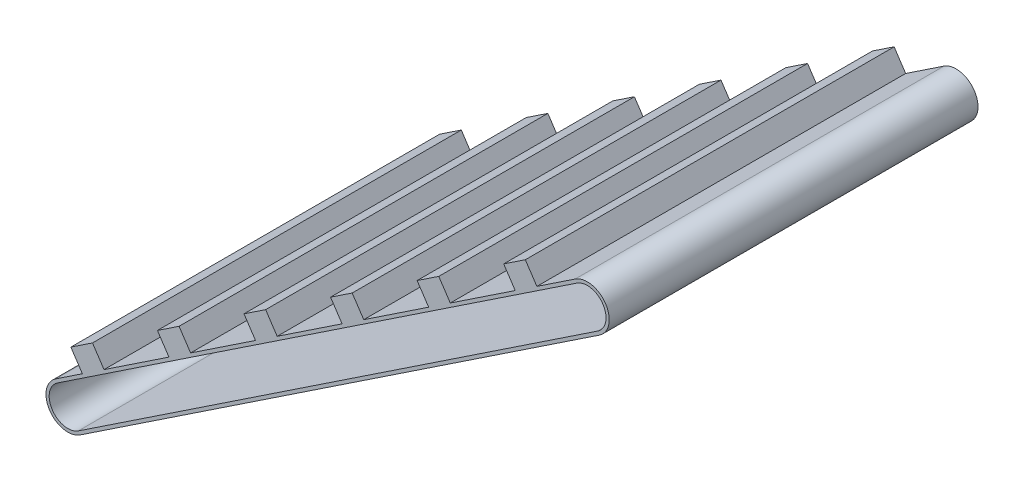
ISO-10303-21;
HEADER;
FILE_DESCRIPTION(('STEP AP214'),'2;1');
FILE_NAME('part.step','',(''),(''),'','','');
FILE_SCHEMA(('AUTOMOTIVE_DESIGN { 1 0 10303 214 1 1 1 1 }'));
ENDSEC;
DATA;
#1=APPLICATION_CONTEXT('core data for automotive mechanical design processes');
#2=APPLICATION_PROTOCOL_DEFINITION('international standard','automotive_design',2000,#1);
#3=PRODUCT_CONTEXT('',#1,'mechanical');
#4=PRODUCT('Part','Part','',(#3));
#5=PRODUCT_RELATED_PRODUCT_CATEGORY('part','',(#4));
#6=PRODUCT_DEFINITION_FORMATION('','',#4);
#7=PRODUCT_DEFINITION_CONTEXT('part definition',#1,'design');
#8=PRODUCT_DEFINITION('design','',#6,#7);
#9=PRODUCT_DEFINITION_SHAPE('','',#8);
#10=(LENGTH_UNIT() NAMED_UNIT(*) SI_UNIT(.MILLI.,.METRE.));
#11=(NAMED_UNIT(*) PLANE_ANGLE_UNIT() SI_UNIT($,.RADIAN.));
#12=(NAMED_UNIT(*) SI_UNIT($,.STERADIAN.) SOLID_ANGLE_UNIT());
#13=UNCERTAINTY_MEASURE_WITH_UNIT(LENGTH_MEASURE(1.E-05),#10,'distance_accuracy_value','');
#14=(GEOMETRIC_REPRESENTATION_CONTEXT(3) GLOBAL_UNCERTAINTY_ASSIGNED_CONTEXT((#13)) GLOBAL_UNIT_ASSIGNED_CONTEXT((#10,
#11,#12)) REPRESENTATION_CONTEXT('',''));
#15=CARTESIAN_POINT('',(0.,0.,0.));
#16=DIRECTION('',(0.,0.,1.));
#17=DIRECTION('',(1.,0.,0.));
#18=AXIS2_PLACEMENT_3D('',#15,#16,#17);
#19=CARTESIAN_POINT('',(-2.33496558165911,3.50348965825732,70.9));
#20=DIRECTION('',(0.554586043536986,-0.832126384820234,0.));
#21=DIRECTION('',(0.832126384820234,0.554586043536986,0.));
#22=AXIS2_PLACEMENT_3D('',#19,#20,#21);
#23=PLANE('',#22);
#24=DIRECTION('',(0.,0.,1.));
#25=VECTOR('',#24,1.);
#26=CARTESIAN_POINT('',(85.998107620927,62.3747025828039,0.));
#27=LINE('',#26,#25);
#28=CARTESIAN_POINT('',(85.998107620927,62.3747025828039,0.));
#29=VERTEX_POINT('',#28);
#30=CARTESIAN_POINT('',(85.998107620927,62.3747025828039,70.9));
#31=VERTEX_POINT('',#30);
#32=EDGE_CURVE('E278',#29,#31,#27,.T.);
#33=ORIENTED_EDGE('',*,*,#32,.F.);
#34=DIRECTION('',(-0.832126384820234,-0.554586043536986,0.));
#35=VECTOR('',#34,1.);
#36=CARTESIAN_POINT('',(-2.33496558165911,3.50348965825732,0.));
#37=LINE('',#36,#35);
#38=CARTESIAN_POINT('',(73.5162118486235,54.0559119297492,0.));
#39=VERTEX_POINT('',#38);
#40=EDGE_CURVE('E542',#29,#39,#37,.T.);
#41=ORIENTED_EDGE('',*,*,#40,.T.);
#42=DIRECTION('',(0.,0.,-1.));
#43=VECTOR('',#42,1.);
#44=CARTESIAN_POINT('',(73.5162118486235,54.0559119297491,0.));
#45=LINE('',#44,#43);
#46=CARTESIAN_POINT('',(73.5162118486235,54.0559119297492,70.9));
#47=VERTEX_POINT('',#46);
#48=EDGE_CURVE('E285',#47,#39,#45,.T.);
#49=ORIENTED_EDGE('',*,*,#48,.F.);
#50=DIRECTION('',(-0.832126384820234,-0.554586043536986,0.));
#51=VECTOR('',#50,1.);
#52=CARTESIAN_POINT('',(-2.33496558165911,3.50348965825732,70.9));
#53=LINE('',#52,#51);
#54=EDGE_CURVE('E57',#31,#47,#53,.T.);
#55=ORIENTED_EDGE('',*,*,#54,.F.);
#56=EDGE_LOOP('',(#33,#41,#49,#55));
#57=FACE_BOUND('',#56,.T.);
#58=ADVANCED_FACE('F41',(#57),#23,.F.);
#59=DIRECTION('',(0.,0.,-1.));
#60=VECTOR('',#59,1.);
#61=CARTESIAN_POINT('',(90.1587395450282,65.1476328004889,0.));
#62=LINE('',#61,#60);
#63=CARTESIAN_POINT('',(90.1587395450282,65.1476328004889,70.9));
#64=VERTEX_POINT('',#63);
#65=CARTESIAN_POINT('',(90.1587395450282,65.1476328004889,0.));
#66=VERTEX_POINT('',#65);
#67=EDGE_CURVE('E65',#64,#66,#62,.T.);
#68=ORIENTED_EDGE('',*,*,#67,.F.);
#69=CARTESIAN_POINT('',(97.520200596769,70.0538148826957,70.9));
#70=VERTEX_POINT('',#69);
#71=EDGE_CURVE('E526',#70,#64,#53,.T.);
#72=ORIENTED_EDGE('',*,*,#71,.F.);
#73=DIRECTION('',(0.,0.,-1.));
#74=VECTOR('',#73,1.);
#75=CARTESIAN_POINT('',(97.520200596769,70.0538148826957,70.9));
#76=LINE('',#75,#74);
#77=CARTESIAN_POINT('',(97.520200596769,70.0538148826957,0.));
#78=VERTEX_POINT('',#77);
#79=EDGE_CURVE('E546',#70,#78,#76,.T.);
#80=ORIENTED_EDGE('',*,*,#79,.T.);
#81=EDGE_CURVE('E519',#78,#66,#37,.T.);
#82=ORIENTED_EDGE('',*,*,#81,.T.);
#83=EDGE_LOOP('',(#68,#72,#80,#82));
#84=FACE_BOUND('',#83,.T.);
#85=ADVANCED_FACE('F565',(#84),#23,.F.);
#86=DIRECTION('',(0.,0.,1.));
#87=VECTOR('',#86,1.);
#88=CARTESIAN_POINT('',(69.3555799245223,51.2829817120642,0.));
#89=LINE('',#88,#87);
#90=CARTESIAN_POINT('',(69.3555799245223,51.2829817120642,0.));
#91=VERTEX_POINT('',#90);
#92=CARTESIAN_POINT('',(69.3555799245223,51.2829817120642,70.9));
#93=VERTEX_POINT('',#92);
#94=EDGE_CURVE('E280',#91,#93,#89,.T.);
#95=ORIENTED_EDGE('',*,*,#94,.F.);
#96=CARTESIAN_POINT('',(56.8736841522188,42.9641910590094,0.));
#97=VERTEX_POINT('',#96);
#98=EDGE_CURVE('E583',#91,#97,#37,.T.);
#99=ORIENTED_EDGE('',*,*,#98,.T.);
#100=DIRECTION('',(0.,0.,-1.));
#101=VECTOR('',#100,1.);
#102=CARTESIAN_POINT('',(56.8736841522188,42.9641910590094,0.));
#103=LINE('',#102,#101);
#104=CARTESIAN_POINT('',(56.8736841522188,42.9641910590094,70.9));
#105=VERTEX_POINT('',#104);
#106=EDGE_CURVE('E329',#105,#97,#103,.T.);
#107=ORIENTED_EDGE('',*,*,#106,.F.);
#108=EDGE_CURVE('E642',#93,#105,#53,.T.);
#109=ORIENTED_EDGE('',*,*,#108,.F.);
#110=EDGE_LOOP('',(#95,#99,#107,#109));
#111=FACE_BOUND('',#110,.T.);
#112=ADVANCED_FACE('F590',(#111),#23,.F.);
#113=DIRECTION('',(0.,0.,1.));
#114=VECTOR('',#113,1.);
#115=CARTESIAN_POINT('',(52.7130522281177,40.1912608413245,0.));
#116=LINE('',#115,#114);
#117=CARTESIAN_POINT('',(52.7130522281177,40.1912608413245,0.));
#118=VERTEX_POINT('',#117);
#119=CARTESIAN_POINT('',(52.7130522281176,40.1912608413245,70.9));
#120=VERTEX_POINT('',#119);
#121=EDGE_CURVE('E323',#118,#120,#116,.T.);
#122=ORIENTED_EDGE('',*,*,#121,.F.);
#123=CARTESIAN_POINT('',(40.2311564558142,31.8724701882697,0.));
#124=VERTEX_POINT('',#123);
#125=EDGE_CURVE('E618',#118,#124,#37,.T.);
#126=ORIENTED_EDGE('',*,*,#125,.T.);
#127=DIRECTION('',(0.,0.,-1.));
#128=VECTOR('',#127,1.);
#129=CARTESIAN_POINT('',(40.2311564558141,31.8724701882697,0.));
#130=LINE('',#129,#128);
#131=CARTESIAN_POINT('',(40.2311564558142,31.8724701882697,70.9));
#132=VERTEX_POINT('',#131);
#133=EDGE_CURVE('E366',#132,#124,#130,.T.);
#134=ORIENTED_EDGE('',*,*,#133,.F.);
#135=EDGE_CURVE('E645',#120,#132,#53,.T.);
#136=ORIENTED_EDGE('',*,*,#135,.F.);
#137=EDGE_LOOP('',(#122,#126,#134,#136));
#138=FACE_BOUND('',#137,.T.);
#139=ADVANCED_FACE('F928',(#138),#23,.F.);
#140=DIRECTION('',(0.,0.,1.));
#141=VECTOR('',#140,1.);
#142=CARTESIAN_POINT('',(36.070524531713,29.0995399705848,0.));
#143=LINE('',#142,#141);
#144=CARTESIAN_POINT('',(36.070524531713,29.0995399705848,0.));
#145=VERTEX_POINT('',#144);
#146=CARTESIAN_POINT('',(36.0705245317129,29.0995399705848,70.9));
#147=VERTEX_POINT('',#146);
#148=EDGE_CURVE('E360',#145,#147,#143,.T.);
#149=ORIENTED_EDGE('',*,*,#148,.F.);
#150=CARTESIAN_POINT('',(23.5886287594095,20.78074931753,0.));
#151=VERTEX_POINT('',#150);
#152=EDGE_CURVE('E614',#145,#151,#37,.T.);
#153=ORIENTED_EDGE('',*,*,#152,.T.);
#154=DIRECTION('',(0.,0.,-1.));
#155=VECTOR('',#154,1.);
#156=CARTESIAN_POINT('',(23.5886287594095,20.78074931753,0.));
#157=LINE('',#156,#155);
#158=CARTESIAN_POINT('',(23.5886287594095,20.78074931753,70.9));
#159=VERTEX_POINT('',#158);
#160=EDGE_CURVE('E403',#159,#151,#157,.T.);
#161=ORIENTED_EDGE('',*,*,#160,.F.);
#162=EDGE_CURVE('E648',#147,#159,#53,.T.);
#163=ORIENTED_EDGE('',*,*,#162,.F.);
#164=EDGE_LOOP('',(#149,#153,#161,#163));
#165=FACE_BOUND('',#164,.T.);
#166=ADVANCED_FACE('F601',(#165),#23,.F.);
#167=DIRECTION('',(0.,0.,1.));
#168=VECTOR('',#167,1.);
#169=CARTESIAN_POINT('',(19.4279968353083,18.007819099845,0.));
#170=LINE('',#169,#168);
#171=CARTESIAN_POINT('',(19.4279968353083,18.007819099845,0.));
#172=VERTEX_POINT('',#171);
#173=CARTESIAN_POINT('',(19.4279968353083,18.007819099845,70.9));
#174=VERTEX_POINT('',#173);
#175=EDGE_CURVE('E397',#172,#174,#170,.T.);
#176=ORIENTED_EDGE('',*,*,#175,.F.);
#177=CARTESIAN_POINT('',(6.94610106300478,9.68902844679025,0.));
#178=VERTEX_POINT('',#177);
#179=EDGE_CURVE('E612',#172,#178,#37,.T.);
#180=ORIENTED_EDGE('',*,*,#179,.T.);
#181=DIRECTION('',(0.,0.,-1.));
#182=VECTOR('',#181,1.);
#183=CARTESIAN_POINT('',(6.94610106300478,9.68902844679025,0.));
#184=LINE('',#183,#182);
#185=CARTESIAN_POINT('',(6.94610106300479,9.68902844679026,70.9));
#186=VERTEX_POINT('',#185);
#187=EDGE_CURVE('E440',#186,#178,#184,.T.);
#188=ORIENTED_EDGE('',*,*,#187,.F.);
#189=EDGE_CURVE('E651',#174,#186,#53,.T.);
#190=ORIENTED_EDGE('',*,*,#189,.F.);
#191=EDGE_LOOP('',(#176,#180,#188,#190));
#192=FACE_BOUND('',#191,.T.);
#193=ADVANCED_FACE('F594',(#192),#23,.F.);
#194=DIRECTION('',(0.,0.,1.));
#195=VECTOR('',#194,1.);
#196=CARTESIAN_POINT('',(2.78546913890361,6.91609822910532,0.));
#197=LINE('',#196,#195);
#198=CARTESIAN_POINT('',(2.78546913890361,6.91609822910532,0.));
#199=VERTEX_POINT('',#198);
#200=CARTESIAN_POINT('',(2.78546913890361,6.91609822910532,70.9));
#201=VERTEX_POINT('',#200);
#202=EDGE_CURVE('E434',#199,#201,#197,.T.);
#203=ORIENTED_EDGE('',*,*,#202,.F.);
#204=CARTESIAN_POINT('',(-2.33496558165911,3.50348965825732,0.));
#205=VERTEX_POINT('',#204);
#206=EDGE_CURVE('E539',#199,#205,#37,.T.);
#207=ORIENTED_EDGE('',*,*,#206,.T.);
#208=DIRECTION('',(0.,0.,-1.));
#209=VECTOR('',#208,1.);
#210=CARTESIAN_POINT('',(-2.33496558165911,3.50348965825732,70.9));
#211=LINE('',#210,#209);
#212=CARTESIAN_POINT('',(-2.33496558165911,3.50348965825732,70.9));
#213=VERTEX_POINT('',#212);
#214=EDGE_CURVE('E529',#213,#205,#211,.T.);
#215=ORIENTED_EDGE('',*,*,#214,.F.);
#216=EDGE_CURVE('E525',#201,#213,#53,.T.);
#217=ORIENTED_EDGE('',*,*,#216,.F.);
#218=EDGE_LOOP('',(#203,#207,#215,#217));
#219=FACE_BOUND('',#218,.T.);
#220=ADVANCED_FACE('F586',(#219),#23,.F.);
#221=CARTESIAN_POINT('',(0.,0.,70.9));
#222=DIRECTION('',(0.,0.,1.));
#223=DIRECTION('',(1.,0.,0.));
#224=AXIS2_PLACEMENT_3D('',#221,#222,#223);
#225=PLANE('',#224);
#226=CARTESIAN_POINT('',(0.,0.,70.9));
#227=DIRECTION('',(0.,0.,1.));
#228=DIRECTION('',(1.,0.,0.));
#229=AXIS2_PLACEMENT_3D('',#226,#227,#228);
#230=CIRCLE('',#229,4.2102855073081);
#231=CARTESIAN_POINT('',(2.33496558165911,-3.50348965825732,70.9));
#232=VERTEX_POINT('',#231);
#233=EDGE_CURVE('E515',#213,#232,#230,.T.);
#234=ORIENTED_EDGE('',*,*,#233,.T.);
#235=DIRECTION('',(0.832126384820234,0.554586043536986,0.));
#236=VECTOR('',#235,1.);
#237=CARTESIAN_POINT('',(2.33496558165911,-3.50348965825732,70.9));
#238=LINE('',#237,#236);
#239=CARTESIAN_POINT('',(102.190131760087,63.046835566181,70.9));
#240=VERTEX_POINT('',#239);
#241=EDGE_CURVE('E518',#232,#240,#238,.T.);
#242=ORIENTED_EDGE('',*,*,#241,.T.);
#243=CARTESIAN_POINT('',(99.8551661784281,66.5503252244383,70.9));
#244=DIRECTION('',(0.,0.,1.));
#245=DIRECTION('',(1.,0.,0.));
#246=AXIS2_PLACEMENT_3D('',#243,#244,#245);
#247=CIRCLE('',#246,4.21028550730811);
#248=EDGE_CURVE('E522',#240,#70,#247,.T.);
#249=ORIENTED_EDGE('',*,*,#248,.T.);
#250=ORIENTED_EDGE('',*,*,#71,.T.);
#251=DIRECTION('',(0.554586043536986,-0.832126384820234,0.));
#252=VECTOR('',#251,1.);
#253=CARTESIAN_POINT('',(87.9403953708803,68.4761383397698,70.9));
#254=LINE('',#253,#252);
#255=CARTESIAN_POINT('',(87.9403953708803,68.4761383397698,70.9));
#256=VERTEX_POINT('',#255);
#257=EDGE_CURVE('E261',#256,#64,#254,.T.);
#258=ORIENTED_EDGE('',*,*,#257,.F.);
#259=DIRECTION('',(0.832126384820234,0.554586043536986,0.));
#260=VECTOR('',#259,1.);
#261=CARTESIAN_POINT('',(83.7797634467791,65.7032081220849,70.9));
#262=LINE('',#261,#260);
#263=CARTESIAN_POINT('',(83.7797634467791,65.7032081220849,70.9));
#264=VERTEX_POINT('',#263);
#265=EDGE_CURVE('E252',#264,#256,#262,.T.);
#266=ORIENTED_EDGE('',*,*,#265,.F.);
#267=DIRECTION('',(0.554586043536986,-0.832126384820234,0.));
#268=VECTOR('',#267,1.);
#269=CARTESIAN_POINT('',(83.7797634467791,65.7032081220849,70.9));
#270=LINE('',#269,#268);
#271=EDGE_CURVE('E258',#264,#31,#270,.T.);
#272=ORIENTED_EDGE('',*,*,#271,.T.);
#273=ORIENTED_EDGE('',*,*,#54,.T.);
#274=DIRECTION('',(0.554586043536986,-0.832126384820234,0.));
#275=VECTOR('',#274,1.);
#276=CARTESIAN_POINT('',(71.2978676744756,57.3844174690301,70.9));
#277=LINE('',#276,#275);
#278=CARTESIAN_POINT('',(71.2978676744756,57.3844174690301,70.9));
#279=VERTEX_POINT('',#278);
#280=EDGE_CURVE('E315',#279,#47,#277,.T.);
#281=ORIENTED_EDGE('',*,*,#280,.F.);
#282=DIRECTION('',(0.832126384820234,0.554586043536986,0.));
#283=VECTOR('',#282,1.);
#284=CARTESIAN_POINT('',(67.1372357503744,54.6114872513451,70.9));
#285=LINE('',#284,#283);
#286=CARTESIAN_POINT('',(67.1372357503744,54.6114872513451,70.9));
#287=VERTEX_POINT('',#286);
#288=EDGE_CURVE('E295',#287,#279,#285,.T.);
#289=ORIENTED_EDGE('',*,*,#288,.F.);
#290=DIRECTION('',(0.554586043536986,-0.832126384820234,0.));
#291=VECTOR('',#290,1.);
#292=CARTESIAN_POINT('',(67.1372357503744,54.6114872513451,70.9));
#293=LINE('',#292,#291);
#294=EDGE_CURVE('E319',#287,#93,#293,.T.);
#295=ORIENTED_EDGE('',*,*,#294,.T.);
#296=ORIENTED_EDGE('',*,*,#108,.T.);
#297=DIRECTION('',(0.554586043536986,-0.832126384820234,0.));
#298=VECTOR('',#297,1.);
#299=CARTESIAN_POINT('',(54.6553399780709,46.2926965982904,70.9));
#300=LINE('',#299,#298);
#301=CARTESIAN_POINT('',(54.6553399780709,46.2926965982904,70.9));
#302=VERTEX_POINT('',#301);
#303=EDGE_CURVE('E352',#302,#105,#300,.T.);
#304=ORIENTED_EDGE('',*,*,#303,.F.);
#305=DIRECTION('',(0.832126384820234,0.554586043536986,0.));
#306=VECTOR('',#305,1.);
#307=CARTESIAN_POINT('',(50.4947080539697,43.5197663806054,70.9));
#308=LINE('',#307,#306);
#309=CARTESIAN_POINT('',(50.4947080539697,43.5197663806054,70.9));
#310=VERTEX_POINT('',#309);
#311=EDGE_CURVE('E328',#310,#302,#308,.T.);
#312=ORIENTED_EDGE('',*,*,#311,.F.);
#313=DIRECTION('',(0.554586043536986,-0.832126384820234,0.));
#314=VECTOR('',#313,1.);
#315=CARTESIAN_POINT('',(50.4947080539697,43.5197663806054,70.9));
#316=LINE('',#315,#314);
#317=EDGE_CURVE('E356',#310,#120,#316,.T.);
#318=ORIENTED_EDGE('',*,*,#317,.T.);
#319=ORIENTED_EDGE('',*,*,#135,.T.);
#320=DIRECTION('',(0.554586043536986,-0.832126384820234,0.));
#321=VECTOR('',#320,1.);
#322=CARTESIAN_POINT('',(38.0128122816662,35.2009757275506,70.9));
#323=LINE('',#322,#321);
#324=CARTESIAN_POINT('',(38.0128122816662,35.2009757275506,70.9));
#325=VERTEX_POINT('',#324);
#326=EDGE_CURVE('E389',#325,#132,#323,.T.);
#327=ORIENTED_EDGE('',*,*,#326,.F.);
#328=DIRECTION('',(0.832126384820234,0.554586043536986,0.));
#329=VECTOR('',#328,1.);
#330=CARTESIAN_POINT('',(33.852180357565,32.4280455098657,70.9));
#331=LINE('',#330,#329);
#332=CARTESIAN_POINT('',(33.852180357565,32.4280455098657,70.9));
#333=VERTEX_POINT('',#332);
#334=EDGE_CURVE('E365',#333,#325,#331,.T.);
#335=ORIENTED_EDGE('',*,*,#334,.F.);
#336=DIRECTION('',(0.554586043536986,-0.832126384820234,0.));
#337=VECTOR('',#336,1.);
#338=CARTESIAN_POINT('',(33.852180357565,32.4280455098657,70.9));
#339=LINE('',#338,#337);
#340=EDGE_CURVE('E393',#333,#147,#339,.T.);
#341=ORIENTED_EDGE('',*,*,#340,.T.);
#342=ORIENTED_EDGE('',*,*,#162,.T.);
#343=DIRECTION('',(0.554586043536986,-0.832126384820234,0.));
#344=VECTOR('',#343,1.);
#345=CARTESIAN_POINT('',(21.3702845852615,24.1092548568109,70.9));
#346=LINE('',#345,#344);
#347=CARTESIAN_POINT('',(21.3702845852615,24.1092548568109,70.9));
#348=VERTEX_POINT('',#347);
#349=EDGE_CURVE('E426',#348,#159,#346,.T.);
#350=ORIENTED_EDGE('',*,*,#349,.F.);
#351=DIRECTION('',(0.832126384820234,0.554586043536986,0.));
#352=VECTOR('',#351,1.);
#353=CARTESIAN_POINT('',(17.2096526611604,21.336324639126,70.9));
#354=LINE('',#353,#352);
#355=CARTESIAN_POINT('',(17.2096526611604,21.336324639126,70.9));
#356=VERTEX_POINT('',#355);
#357=EDGE_CURVE('E402',#356,#348,#354,.T.);
#358=ORIENTED_EDGE('',*,*,#357,.F.);
#359=DIRECTION('',(0.554586043536986,-0.832126384820234,0.));
#360=VECTOR('',#359,1.);
#361=CARTESIAN_POINT('',(17.2096526611604,21.336324639126,70.9));
#362=LINE('',#361,#360);
#363=EDGE_CURVE('E430',#356,#174,#362,.T.);
#364=ORIENTED_EDGE('',*,*,#363,.T.);
#365=ORIENTED_EDGE('',*,*,#189,.T.);
#366=DIRECTION('',(0.554586043536986,-0.832126384820234,0.));
#367=VECTOR('',#366,1.);
#368=CARTESIAN_POINT('',(4.72775688885686,13.0175339860712,70.9));
#369=LINE('',#368,#367);
#370=CARTESIAN_POINT('',(4.72775688885686,13.0175339860712,70.9));
#371=VERTEX_POINT('',#370);
#372=EDGE_CURVE('E463',#371,#186,#369,.T.);
#373=ORIENTED_EDGE('',*,*,#372,.F.);
#374=DIRECTION('',(0.832126384820234,0.554586043536986,0.));
#375=VECTOR('',#374,1.);
#376=CARTESIAN_POINT('',(0.567124964755668,10.2446037683863,70.9));
#377=LINE('',#376,#375);
#378=CARTESIAN_POINT('',(0.567124964755668,10.2446037683863,70.9));
#379=VERTEX_POINT('',#378);
#380=EDGE_CURVE('E439',#379,#371,#377,.T.);
#381=ORIENTED_EDGE('',*,*,#380,.F.);
#382=DIRECTION('',(0.554586043536986,-0.832126384820234,0.));
#383=VECTOR('',#382,1.);
#384=CARTESIAN_POINT('',(0.567124964755668,10.2446037683863,70.9));
#385=LINE('',#384,#383);
#386=EDGE_CURVE('E467',#379,#201,#385,.T.);
#387=ORIENTED_EDGE('',*,*,#386,.T.);
#388=ORIENTED_EDGE('',*,*,#216,.T.);
#389=EDGE_LOOP('',(#234,#242,#249,#250,#258,#266,#272,#273,#281,#289,#295,#296,#304,#312,#318,
#319,#327,#335,#341,#342,#350,#358,#364,#365,#373,#381,#387,#388));
#390=FACE_BOUND('',#389,.T.);
#391=DIRECTION('',(0.832126384820234,0.554586043536986,0.));
#392=VECTOR('',#391,1.);
#393=CARTESIAN_POINT('',(1.99650975673315,-2.99565498535284,70.9));
#394=LINE('',#393,#392);
#395=CARTESIAN_POINT('',(1.99650975673315,-2.99565498535284,70.9));
#396=VERTEX_POINT('',#395);
#397=CARTESIAN_POINT('',(101.851675935161,63.5546702390855,70.9));
#398=VERTEX_POINT('',#397);
#399=EDGE_CURVE('E475',#396,#398,#394,.T.);
#400=ORIENTED_EDGE('',*,*,#399,.F.);
#401=CARTESIAN_POINT('',(0.,0.,70.9));
#402=DIRECTION('',(0.,0.,1.));
#403=DIRECTION('',(1.,0.,0.));
#404=AXIS2_PLACEMENT_3D('',#401,#402,#403);
#405=CIRCLE('',#404,3.6);
#406=CARTESIAN_POINT('',(-1.99650975673315,2.99565498535284,70.9));
#407=VERTEX_POINT('',#406);
#408=EDGE_CURVE('E472',#407,#396,#405,.T.);
#409=ORIENTED_EDGE('',*,*,#408,.F.);
#410=DIRECTION('',(-0.832126384820234,-0.554586043536986,0.));
#411=VECTOR('',#410,1.);
#412=CARTESIAN_POINT('',(-1.99650975673315,2.99565498535284,70.9));
#413=LINE('',#412,#411);
#414=CARTESIAN_POINT('',(97.8586564216949,69.5459802097912,70.9));
#415=VERTEX_POINT('',#414);
#416=EDGE_CURVE('E483',#415,#407,#413,.T.);
#417=ORIENTED_EDGE('',*,*,#416,.F.);
#418=CARTESIAN_POINT('',(99.8551661784281,66.5503252244383,70.9));
#419=DIRECTION('',(0.,0.,1.));
#420=DIRECTION('',(1.,0.,0.));
#421=AXIS2_PLACEMENT_3D('',#418,#419,#420);
#422=CIRCLE('',#421,3.6);
#423=EDGE_CURVE('E479',#398,#415,#422,.T.);
#424=ORIENTED_EDGE('',*,*,#423,.F.);
#425=EDGE_LOOP('',(#400,#409,#417,#424));
#426=FACE_BOUND('',#425,.T.);
#427=ADVANCED_FACE('F255',(#390,#426),#225,.T.);
#428=CARTESIAN_POINT('',(0.,0.,0.));
#429=DIRECTION('',(0.,0.,1.));
#430=DIRECTION('',(1.,0.,0.));
#431=AXIS2_PLACEMENT_3D('',#428,#429,#430);
#432=PLANE('',#431);
#433=CARTESIAN_POINT('',(0.,0.,0.));
#434=DIRECTION('',(0.,0.,1.));
#435=DIRECTION('',(1.,0.,0.));
#436=AXIS2_PLACEMENT_3D('',#433,#434,#435);
#437=CIRCLE('',#436,4.2102855073081);
#438=CARTESIAN_POINT('',(2.33496558165911,-3.50348965825732,0.));
#439=VERTEX_POINT('',#438);
#440=EDGE_CURVE('E514',#205,#439,#437,.T.);
#441=ORIENTED_EDGE('',*,*,#440,.F.);
#442=ORIENTED_EDGE('',*,*,#206,.F.);
#443=DIRECTION('',(0.554586043536986,-0.832126384820234,0.));
#444=VECTOR('',#443,1.);
#445=CARTESIAN_POINT('',(0.567124964755668,10.2446037683863,0.));
#446=LINE('',#445,#444);
#447=CARTESIAN_POINT('',(0.567124964755668,10.2446037683863,0.));
#448=VERTEX_POINT('',#447);
#449=EDGE_CURVE('E449',#448,#199,#446,.T.);
#450=ORIENTED_EDGE('',*,*,#449,.F.);
#451=DIRECTION('',(-0.832126384820234,-0.554586043536986,0.));
#452=VECTOR('',#451,1.);
#453=CARTESIAN_POINT('',(0.567124964755668,10.2446037683863,0.));
#454=LINE('',#453,#452);
#455=CARTESIAN_POINT('',(4.72775688885684,13.0175339860712,0.));
#456=VERTEX_POINT('',#455);
#457=EDGE_CURVE('E446',#456,#448,#454,.T.);
#458=ORIENTED_EDGE('',*,*,#457,.F.);
#459=DIRECTION('',(0.554586043536986,-0.832126384820234,0.));
#460=VECTOR('',#459,1.);
#461=CARTESIAN_POINT('',(4.72775688885684,13.0175339860712,0.));
#462=LINE('',#461,#460);
#463=EDGE_CURVE('E459',#456,#178,#462,.T.);
#464=ORIENTED_EDGE('',*,*,#463,.T.);
#465=ORIENTED_EDGE('',*,*,#179,.F.);
#466=DIRECTION('',(0.554586043536986,-0.832126384820234,0.));
#467=VECTOR('',#466,1.);
#468=CARTESIAN_POINT('',(17.2096526611604,21.336324639126,0.));
#469=LINE('',#468,#467);
#470=CARTESIAN_POINT('',(17.2096526611604,21.336324639126,0.));
#471=VERTEX_POINT('',#470);
#472=EDGE_CURVE('E412',#471,#172,#469,.T.);
#473=ORIENTED_EDGE('',*,*,#472,.F.);
#474=DIRECTION('',(-0.832126384820234,-0.554586043536986,0.));
#475=VECTOR('',#474,1.);
#476=CARTESIAN_POINT('',(17.2096526611604,21.336324639126,0.));
#477=LINE('',#476,#475);
#478=CARTESIAN_POINT('',(21.3702845852615,24.1092548568109,0.));
#479=VERTEX_POINT('',#478);
#480=EDGE_CURVE('E409',#479,#471,#477,.T.);
#481=ORIENTED_EDGE('',*,*,#480,.F.);
#482=DIRECTION('',(0.554586043536986,-0.832126384820234,0.));
#483=VECTOR('',#482,1.);
#484=CARTESIAN_POINT('',(21.3702845852615,24.1092548568109,0.));
#485=LINE('',#484,#483);
#486=EDGE_CURVE('E422',#479,#151,#485,.T.);
#487=ORIENTED_EDGE('',*,*,#486,.T.);
#488=ORIENTED_EDGE('',*,*,#152,.F.);
#489=DIRECTION('',(0.554586043536986,-0.832126384820234,0.));
#490=VECTOR('',#489,1.);
#491=CARTESIAN_POINT('',(33.852180357565,32.4280455098657,0.));
#492=LINE('',#491,#490);
#493=CARTESIAN_POINT('',(33.852180357565,32.4280455098657,0.));
#494=VERTEX_POINT('',#493);
#495=EDGE_CURVE('E375',#494,#145,#492,.T.);
#496=ORIENTED_EDGE('',*,*,#495,.F.);
#497=DIRECTION('',(-0.832126384820234,-0.554586043536986,0.));
#498=VECTOR('',#497,1.);
#499=CARTESIAN_POINT('',(33.852180357565,32.4280455098657,0.));
#500=LINE('',#499,#498);
#501=CARTESIAN_POINT('',(38.0128122816662,35.2009757275506,0.));
#502=VERTEX_POINT('',#501);
#503=EDGE_CURVE('E372',#502,#494,#500,.T.);
#504=ORIENTED_EDGE('',*,*,#503,.F.);
#505=DIRECTION('',(0.554586043536986,-0.832126384820234,0.));
#506=VECTOR('',#505,1.);
#507=CARTESIAN_POINT('',(38.0128122816662,35.2009757275506,0.));
#508=LINE('',#507,#506);
#509=EDGE_CURVE('E385',#502,#124,#508,.T.);
#510=ORIENTED_EDGE('',*,*,#509,.T.);
#511=ORIENTED_EDGE('',*,*,#125,.F.);
#512=DIRECTION('',(0.554586043536986,-0.832126384820234,0.));
#513=VECTOR('',#512,1.);
#514=CARTESIAN_POINT('',(50.4947080539697,43.5197663806054,0.));
#515=LINE('',#514,#513);
#516=CARTESIAN_POINT('',(50.4947080539697,43.5197663806054,0.));
#517=VERTEX_POINT('',#516);
#518=EDGE_CURVE('E338',#517,#118,#515,.T.);
#519=ORIENTED_EDGE('',*,*,#518,.F.);
#520=DIRECTION('',(-0.832126384820234,-0.554586043536986,0.));
#521=VECTOR('',#520,1.);
#522=CARTESIAN_POINT('',(50.4947080539697,43.5197663806054,0.));
#523=LINE('',#522,#521);
#524=CARTESIAN_POINT('',(54.6553399780709,46.2926965982904,0.));
#525=VERTEX_POINT('',#524);
#526=EDGE_CURVE('E335',#525,#517,#523,.T.);
#527=ORIENTED_EDGE('',*,*,#526,.F.);
#528=DIRECTION('',(0.554586043536986,-0.832126384820234,0.));
#529=VECTOR('',#528,1.);
#530=CARTESIAN_POINT('',(54.6553399780709,46.2926965982904,0.));
#531=LINE('',#530,#529);
#532=EDGE_CURVE('E348',#525,#97,#531,.T.);
#533=ORIENTED_EDGE('',*,*,#532,.T.);
#534=ORIENTED_EDGE('',*,*,#98,.F.);
#535=DIRECTION('',(0.554586043536986,-0.832126384820234,0.));
#536=VECTOR('',#535,1.);
#537=CARTESIAN_POINT('',(67.1372357503744,54.6114872513451,0.));
#538=LINE('',#537,#536);
#539=CARTESIAN_POINT('',(67.1372357503744,54.6114872513451,0.));
#540=VERTEX_POINT('',#539);
#541=EDGE_CURVE('E303',#540,#91,#538,.T.);
#542=ORIENTED_EDGE('',*,*,#541,.F.);
#543=DIRECTION('',(-0.832126384820234,-0.554586043536986,0.));
#544=VECTOR('',#543,1.);
#545=CARTESIAN_POINT('',(67.1372357503744,54.6114872513451,0.));
#546=LINE('',#545,#544);
#547=CARTESIAN_POINT('',(71.2978676744756,57.3844174690301,0.));
#548=VERTEX_POINT('',#547);
#549=EDGE_CURVE('E301',#548,#540,#546,.T.);
#550=ORIENTED_EDGE('',*,*,#549,.F.);
#551=DIRECTION('',(0.554586043536986,-0.832126384820234,0.));
#552=VECTOR('',#551,1.);
#553=CARTESIAN_POINT('',(71.2978676744756,57.3844174690301,0.));
#554=LINE('',#553,#552);
#555=EDGE_CURVE('E311',#548,#39,#554,.T.);
#556=ORIENTED_EDGE('',*,*,#555,.T.);
#557=ORIENTED_EDGE('',*,*,#40,.F.);
#558=DIRECTION('',(0.554586043536986,-0.832126384820234,0.));
#559=VECTOR('',#558,1.);
#560=CARTESIAN_POINT('',(83.7797634467791,65.7032081220849,0.));
#561=LINE('',#560,#559);
#562=CARTESIAN_POINT('',(83.7797634467791,65.7032081220849,0.));
#563=VERTEX_POINT('',#562);
#564=EDGE_CURVE('E574',#563,#29,#561,.T.);
#565=ORIENTED_EDGE('',*,*,#564,.F.);
#566=DIRECTION('',(-0.832126384820234,-0.554586043536986,0.));
#567=VECTOR('',#566,1.);
#568=CARTESIAN_POINT('',(83.7797634467791,65.7032081220849,0.));
#569=LINE('',#568,#567);
#570=CARTESIAN_POINT('',(87.9403953708803,68.4761383397698,0.));
#571=VERTEX_POINT('',#570);
#572=EDGE_CURVE('E271',#571,#563,#569,.T.);
#573=ORIENTED_EDGE('',*,*,#572,.F.);
#574=DIRECTION('',(0.554586043536986,-0.832126384820234,0.));
#575=VECTOR('',#574,1.);
#576=CARTESIAN_POINT('',(87.9403953708803,68.4761383397698,0.));
#577=LINE('',#576,#575);
#578=EDGE_CURVE('E287',#571,#66,#577,.T.);
#579=ORIENTED_EDGE('',*,*,#578,.T.);
#580=ORIENTED_EDGE('',*,*,#81,.F.);
#581=CARTESIAN_POINT('',(99.8551661784281,66.5503252244383,0.));
#582=DIRECTION('',(0.,0.,1.));
#583=DIRECTION('',(1.,0.,0.));
#584=AXIS2_PLACEMENT_3D('',#581,#582,#583);
#585=CIRCLE('',#584,4.21028550730811);
#586=CARTESIAN_POINT('',(102.190131760087,63.046835566181,0.));
#587=VERTEX_POINT('',#586);
#588=EDGE_CURVE('E536',#587,#78,#585,.T.);
#589=ORIENTED_EDGE('',*,*,#588,.F.);
#590=DIRECTION('',(0.832126384820234,0.554586043536986,0.));
#591=VECTOR('',#590,1.);
#592=CARTESIAN_POINT('',(2.33496558165911,-3.50348965825732,0.));
#593=LINE('',#592,#591);
#594=EDGE_CURVE('E533',#439,#587,#593,.T.);
#595=ORIENTED_EDGE('',*,*,#594,.F.);
#596=EDGE_LOOP('',(#441,#442,#450,#458,#464,#465,#473,#481,#487,#488,#496,#504,#510,#511,#519,
#527,#533,#534,#542,#550,#556,#557,#565,#573,#579,#580,#589,#595));
#597=FACE_BOUND('',#596,.T.);
#598=CARTESIAN_POINT('',(0.,0.,0.));
#599=DIRECTION('',(0.,0.,1.));
#600=DIRECTION('',(1.,0.,0.));
#601=AXIS2_PLACEMENT_3D('',#598,#599,#600);
#602=CIRCLE('',#601,3.6);
#603=CARTESIAN_POINT('',(-1.99650975673315,2.99565498535284,0.));
#604=VERTEX_POINT('',#603);
#605=CARTESIAN_POINT('',(1.99650975673315,-2.99565498535284,0.));
#606=VERTEX_POINT('',#605);
#607=EDGE_CURVE('E471',#604,#606,#602,.T.);
#608=ORIENTED_EDGE('',*,*,#607,.T.);
#609=DIRECTION('',(0.832126384820234,0.554586043536986,0.));
#610=VECTOR('',#609,1.);
#611=CARTESIAN_POINT('',(1.99650975673315,-2.99565498535284,0.));
#612=LINE('',#611,#610);
#613=CARTESIAN_POINT('',(101.851675935161,63.5546702390855,0.));
#614=VERTEX_POINT('',#613);
#615=EDGE_CURVE('E490',#606,#614,#612,.T.);
#616=ORIENTED_EDGE('',*,*,#615,.T.);
#617=CARTESIAN_POINT('',(99.8551661784281,66.5503252244383,0.));
#618=DIRECTION('',(0.,0.,1.));
#619=DIRECTION('',(1.,0.,0.));
#620=AXIS2_PLACEMENT_3D('',#617,#618,#619);
#621=CIRCLE('',#620,3.6);
#622=CARTESIAN_POINT('',(97.8586564216949,69.5459802097912,0.));
#623=VERTEX_POINT('',#622);
#624=EDGE_CURVE('E494',#614,#623,#621,.T.);
#625=ORIENTED_EDGE('',*,*,#624,.T.);
#626=DIRECTION('',(-0.832126384820234,-0.554586043536986,0.));
#627=VECTOR('',#626,1.);
#628=CARTESIAN_POINT('',(-1.99650975673315,2.99565498535284,0.));
#629=LINE('',#628,#627);
#630=EDGE_CURVE('E476',#623,#604,#629,.T.);
#631=ORIENTED_EDGE('',*,*,#630,.T.);
#632=EDGE_LOOP('',(#608,#616,#625,#631));
#633=FACE_BOUND('',#632,.T.);
#634=ADVANCED_FACE('F561',(#597,#633),#432,.F.);
#635=CARTESIAN_POINT('',(0.,0.,70.9));
#636=DIRECTION('',(0.,0.,-1.));
#637=DIRECTION('',(-1.,0.,0.));
#638=AXIS2_PLACEMENT_3D('',#635,#636,#637);
#639=CYLINDRICAL_SURFACE('',#638,4.2102855073081);
#640=ORIENTED_EDGE('',*,*,#440,.T.);
#641=DIRECTION('',(0.,0.,-1.));
#642=VECTOR('',#641,1.);
#643=CARTESIAN_POINT('',(2.33496558165911,-3.50348965825732,70.9));
#644=LINE('',#643,#642);
#645=EDGE_CURVE('E11',#232,#439,#644,.T.);
#646=ORIENTED_EDGE('',*,*,#645,.F.);
#647=ORIENTED_EDGE('',*,*,#233,.F.);
#648=ORIENTED_EDGE('',*,*,#214,.T.);
#649=EDGE_LOOP('',(#640,#646,#647,#648));
#650=FACE_BOUND('',#649,.T.);
#651=ADVANCED_FACE('F43',(#650),#639,.T.);
#652=CARTESIAN_POINT('',(2.33496558165911,-3.50348965825732,70.9));
#653=DIRECTION('',(-0.554586043536986,0.832126384820234,0.));
#654=DIRECTION('',(-0.832126384820234,-0.554586043536986,0.));
#655=AXIS2_PLACEMENT_3D('',#652,#653,#654);
#656=PLANE('',#655);
#657=ORIENTED_EDGE('',*,*,#594,.T.);
#658=DIRECTION('',(0.,0.,-1.));
#659=VECTOR('',#658,1.);
#660=CARTESIAN_POINT('',(102.190131760087,63.046835566181,70.9));
#661=LINE('',#660,#659);
#662=EDGE_CURVE('E50',#240,#587,#661,.T.);
#663=ORIENTED_EDGE('',*,*,#662,.F.);
#664=ORIENTED_EDGE('',*,*,#241,.F.);
#665=ORIENTED_EDGE('',*,*,#645,.T.);
#666=EDGE_LOOP('',(#657,#663,#664,#665));
#667=FACE_BOUND('',#666,.T.);
#668=ADVANCED_FACE('F659',(#667),#656,.F.);
#669=CARTESIAN_POINT('',(99.8551661784281,66.5503252244383,70.9));
#670=DIRECTION('',(0.,0.,-1.));
#671=DIRECTION('',(-1.,0.,0.));
#672=AXIS2_PLACEMENT_3D('',#669,#670,#671);
#673=CYLINDRICAL_SURFACE('',#672,4.21028550730811);
#674=ORIENTED_EDGE('',*,*,#588,.T.);
#675=ORIENTED_EDGE('',*,*,#79,.F.);
#676=ORIENTED_EDGE('',*,*,#248,.F.);
#677=ORIENTED_EDGE('',*,*,#662,.T.);
#678=EDGE_LOOP('',(#674,#675,#676,#677));
#679=FACE_BOUND('',#678,.T.);
#680=ADVANCED_FACE('F555',(#679),#673,.T.);
#681=CARTESIAN_POINT('',(0.,0.,70.9));
#682=DIRECTION('',(0.,0.,-1.));
#683=DIRECTION('',(-1.,0.,0.));
#684=AXIS2_PLACEMENT_3D('',#681,#682,#683);
#685=CYLINDRICAL_SURFACE('',#684,3.6);
#686=ORIENTED_EDGE('',*,*,#607,.F.);
#687=DIRECTION('',(0.,0.,-1.));
#688=VECTOR('',#687,1.);
#689=CARTESIAN_POINT('',(-1.99650975673315,2.99565498535284,70.9));
#690=LINE('',#689,#688);
#691=EDGE_CURVE('E486',#407,#604,#690,.T.);
#692=ORIENTED_EDGE('',*,*,#691,.F.);
#693=ORIENTED_EDGE('',*,*,#408,.T.);
#694=DIRECTION('',(0.,0.,-1.));
#695=VECTOR('',#694,1.);
#696=CARTESIAN_POINT('',(1.99650975673315,-2.99565498535284,70.9));
#697=LINE('',#696,#695);
#698=EDGE_CURVE('E510',#396,#606,#697,.T.);
#699=ORIENTED_EDGE('',*,*,#698,.T.);
#700=EDGE_LOOP('',(#686,#692,#693,#699));
#701=FACE_BOUND('',#700,.T.);
#702=ADVANCED_FACE('F665',(#701),#685,.F.);
#703=CARTESIAN_POINT('',(1.99650975673315,-2.99565498535284,70.9));
#704=DIRECTION('',(-0.554586043536986,0.832126384820234,0.));
#705=DIRECTION('',(-0.832126384820234,-0.554586043536986,0.));
#706=AXIS2_PLACEMENT_3D('',#703,#704,#705);
#707=PLANE('',#706);
#708=ORIENTED_EDGE('',*,*,#615,.F.);
#709=ORIENTED_EDGE('',*,*,#698,.F.);
#710=ORIENTED_EDGE('',*,*,#399,.T.);
#711=DIRECTION('',(0.,0.,-1.));
#712=VECTOR('',#711,1.);
#713=CARTESIAN_POINT('',(101.851675935161,63.5546702390855,70.9));
#714=LINE('',#713,#712);
#715=EDGE_CURVE('E507',#398,#614,#714,.T.);
#716=ORIENTED_EDGE('',*,*,#715,.T.);
#717=EDGE_LOOP('',(#708,#709,#710,#716));
#718=FACE_BOUND('',#717,.T.);
#719=ADVANCED_FACE('F674',(#718),#707,.T.);
#720=CARTESIAN_POINT('',(99.8551661784281,66.5503252244383,70.9));
#721=DIRECTION('',(0.,0.,-1.));
#722=DIRECTION('',(-1.,0.,0.));
#723=AXIS2_PLACEMENT_3D('',#720,#721,#722);
#724=CYLINDRICAL_SURFACE('',#723,3.6);
#725=ORIENTED_EDGE('',*,*,#624,.F.);
#726=ORIENTED_EDGE('',*,*,#715,.F.);
#727=ORIENTED_EDGE('',*,*,#423,.T.);
#728=DIRECTION('',(0.,0.,-1.));
#729=VECTOR('',#728,1.);
#730=CARTESIAN_POINT('',(97.8586564216949,69.5459802097912,70.9));
#731=LINE('',#730,#729);
#732=EDGE_CURVE('E504',#415,#623,#731,.T.);
#733=ORIENTED_EDGE('',*,*,#732,.T.);
#734=EDGE_LOOP('',(#725,#726,#727,#733));
#735=FACE_BOUND('',#734,.T.);
#736=ADVANCED_FACE('F678',(#735),#724,.F.);
#737=CARTESIAN_POINT('',(-1.99650975673315,2.99565498535284,70.9));
#738=DIRECTION('',(0.554586043536986,-0.832126384820234,0.));
#739=DIRECTION('',(0.832126384820234,0.554586043536986,0.));
#740=AXIS2_PLACEMENT_3D('',#737,#738,#739);
#741=PLANE('',#740);
#742=ORIENTED_EDGE('',*,*,#630,.F.);
#743=ORIENTED_EDGE('',*,*,#732,.F.);
#744=ORIENTED_EDGE('',*,*,#416,.T.);
#745=ORIENTED_EDGE('',*,*,#691,.T.);
#746=EDGE_LOOP('',(#742,#743,#744,#745));
#747=FACE_BOUND('',#746,.T.);
#748=ADVANCED_FACE('F682',(#747),#741,.T.);
#749=CARTESIAN_POINT('',(0.567124964755668,10.2446037683863,0.));
#750=DIRECTION('',(0.832126384820234,0.554586043536986,0.));
#751=DIRECTION('',(-0.554586043536986,0.832126384820234,0.));
#752=AXIS2_PLACEMENT_3D('',#749,#750,#751);
#753=PLANE('',#752);
#754=ORIENTED_EDGE('',*,*,#202,.T.);
#755=ORIENTED_EDGE('',*,*,#386,.F.);
#756=DIRECTION('',(0.,0.,1.));
#757=VECTOR('',#756,1.);
#758=CARTESIAN_POINT('',(0.567124964755668,10.2446037683863,0.));
#759=LINE('',#758,#757);
#760=EDGE_CURVE('E435',#448,#379,#759,.T.);
#761=ORIENTED_EDGE('',*,*,#760,.F.);
#762=ORIENTED_EDGE('',*,*,#449,.T.);
#763=EDGE_LOOP('',(#754,#755,#761,#762));
#764=FACE_BOUND('',#763,.T.);
#765=ADVANCED_FACE('F609',(#764),#753,.F.);
#766=CARTESIAN_POINT('',(4.72775688885684,13.0175339860712,0.));
#767=DIRECTION('',(-0.832126384820234,-0.554586043536986,0.));
#768=DIRECTION('',(0.554586043536986,-0.832126384820234,0.));
#769=AXIS2_PLACEMENT_3D('',#766,#767,#768);
#770=PLANE('',#769);
#771=ORIENTED_EDGE('',*,*,#187,.T.);
#772=ORIENTED_EDGE('',*,*,#463,.F.);
#773=DIRECTION('',(0.,0.,-1.));
#774=VECTOR('',#773,1.);
#775=CARTESIAN_POINT('',(4.72775688885684,13.0175339860712,0.));
#776=LINE('',#775,#774);
#777=EDGE_CURVE('E443',#371,#456,#776,.T.);
#778=ORIENTED_EDGE('',*,*,#777,.F.);
#779=ORIENTED_EDGE('',*,*,#372,.T.);
#780=EDGE_LOOP('',(#771,#772,#778,#779));
#781=FACE_BOUND('',#780,.T.);
#782=ADVANCED_FACE('F689',(#781),#770,.F.);
#783=CARTESIAN_POINT('',(-4.55330975580706,6.83199519753826,0.));
#784=DIRECTION('',(-0.554586043536986,0.832126384820234,0.));
#785=DIRECTION('',(-0.832126384820234,-0.554586043536986,0.));
#786=AXIS2_PLACEMENT_3D('',#783,#784,#785);
#787=PLANE('',#786);
#788=ORIENTED_EDGE('',*,*,#760,.T.);
#789=ORIENTED_EDGE('',*,*,#380,.T.);
#790=ORIENTED_EDGE('',*,*,#777,.T.);
#791=ORIENTED_EDGE('',*,*,#457,.T.);
#792=EDGE_LOOP('',(#788,#789,#790,#791));
#793=FACE_BOUND('',#792,.T.);
#794=ADVANCED_FACE('F692',(#793),#787,.T.);
#795=CARTESIAN_POINT('',(17.2096526611604,21.336324639126,0.));
#796=DIRECTION('',(0.832126384820234,0.554586043536986,0.));
#797=DIRECTION('',(-0.554586043536986,0.832126384820234,0.));
#798=AXIS2_PLACEMENT_3D('',#795,#796,#797);
#799=PLANE('',#798);
#800=ORIENTED_EDGE('',*,*,#175,.T.);
#801=ORIENTED_EDGE('',*,*,#363,.F.);
#802=DIRECTION('',(0.,0.,1.));
#803=VECTOR('',#802,1.);
#804=CARTESIAN_POINT('',(17.2096526611604,21.336324639126,0.));
#805=LINE('',#804,#803);
#806=EDGE_CURVE('E398',#471,#356,#805,.T.);
#807=ORIENTED_EDGE('',*,*,#806,.F.);
#808=ORIENTED_EDGE('',*,*,#472,.T.);
#809=EDGE_LOOP('',(#800,#801,#807,#808));
#810=FACE_BOUND('',#809,.T.);
#811=ADVANCED_FACE('F696',(#810),#799,.F.);
#812=CARTESIAN_POINT('',(21.3702845852615,24.1092548568109,0.));
#813=DIRECTION('',(-0.832126384820234,-0.554586043536986,0.));
#814=DIRECTION('',(0.554586043536986,-0.832126384820234,0.));
#815=AXIS2_PLACEMENT_3D('',#812,#813,#814);
#816=PLANE('',#815);
#817=ORIENTED_EDGE('',*,*,#160,.T.);
#818=ORIENTED_EDGE('',*,*,#486,.F.);
#819=DIRECTION('',(0.,0.,-1.));
#820=VECTOR('',#819,1.);
#821=CARTESIAN_POINT('',(21.3702845852615,24.1092548568109,0.));
#822=LINE('',#821,#820);
#823=EDGE_CURVE('E406',#348,#479,#822,.T.);
#824=ORIENTED_EDGE('',*,*,#823,.F.);
#825=ORIENTED_EDGE('',*,*,#349,.T.);
#826=EDGE_LOOP('',(#817,#818,#824,#825));
#827=FACE_BOUND('',#826,.T.);
#828=ADVANCED_FACE('F700',(#827),#816,.F.);
#829=CARTESIAN_POINT('',(12.0892179405976,17.923716068278,0.));
#830=DIRECTION('',(-0.554586043536986,0.832126384820234,0.));
#831=DIRECTION('',(-0.832126384820234,-0.554586043536986,0.));
#832=AXIS2_PLACEMENT_3D('',#829,#830,#831);
#833=PLANE('',#832);
#834=ORIENTED_EDGE('',*,*,#806,.T.);
#835=ORIENTED_EDGE('',*,*,#357,.T.);
#836=ORIENTED_EDGE('',*,*,#823,.T.);
#837=ORIENTED_EDGE('',*,*,#480,.T.);
#838=EDGE_LOOP('',(#834,#835,#836,#837));
#839=FACE_BOUND('',#838,.T.);
#840=ADVANCED_FACE('F704',(#839),#833,.T.);
#841=CARTESIAN_POINT('',(33.852180357565,32.4280455098657,0.));
#842=DIRECTION('',(0.832126384820234,0.554586043536986,0.));
#843=DIRECTION('',(-0.554586043536986,0.832126384820234,0.));
#844=AXIS2_PLACEMENT_3D('',#841,#842,#843);
#845=PLANE('',#844);
#846=ORIENTED_EDGE('',*,*,#148,.T.);
#847=ORIENTED_EDGE('',*,*,#340,.F.);
#848=DIRECTION('',(0.,0.,1.));
#849=VECTOR('',#848,1.);
#850=CARTESIAN_POINT('',(33.852180357565,32.4280455098657,0.));
#851=LINE('',#850,#849);
#852=EDGE_CURVE('E361',#494,#333,#851,.T.);
#853=ORIENTED_EDGE('',*,*,#852,.F.);
#854=ORIENTED_EDGE('',*,*,#495,.T.);
#855=EDGE_LOOP('',(#846,#847,#853,#854));
#856=FACE_BOUND('',#855,.T.);
#857=ADVANCED_FACE('F708',(#856),#845,.F.);
#858=CARTESIAN_POINT('',(38.0128122816662,35.2009757275506,0.));
#859=DIRECTION('',(-0.832126384820234,-0.554586043536986,0.));
#860=DIRECTION('',(0.554586043536986,-0.832126384820234,0.));
#861=AXIS2_PLACEMENT_3D('',#858,#859,#860);
#862=PLANE('',#861);
#863=ORIENTED_EDGE('',*,*,#133,.T.);
#864=ORIENTED_EDGE('',*,*,#509,.F.);
#865=DIRECTION('',(0.,0.,-1.));
#866=VECTOR('',#865,1.);
#867=CARTESIAN_POINT('',(38.0128122816662,35.2009757275506,0.));
#868=LINE('',#867,#866);
#869=EDGE_CURVE('E369',#325,#502,#868,.T.);
#870=ORIENTED_EDGE('',*,*,#869,.F.);
#871=ORIENTED_EDGE('',*,*,#326,.T.);
#872=EDGE_LOOP('',(#863,#864,#870,#871));
#873=FACE_BOUND('',#872,.T.);
#874=ADVANCED_FACE('F712',(#873),#862,.F.);
#875=CARTESIAN_POINT('',(28.7317456370023,29.0154369390177,0.));
#876=DIRECTION('',(-0.554586043536986,0.832126384820234,0.));
#877=DIRECTION('',(-0.832126384820234,-0.554586043536986,0.));
#878=AXIS2_PLACEMENT_3D('',#875,#876,#877);
#879=PLANE('',#878);
#880=ORIENTED_EDGE('',*,*,#852,.T.);
#881=ORIENTED_EDGE('',*,*,#334,.T.);
#882=ORIENTED_EDGE('',*,*,#869,.T.);
#883=ORIENTED_EDGE('',*,*,#503,.T.);
#884=EDGE_LOOP('',(#880,#881,#882,#883));
#885=FACE_BOUND('',#884,.T.);
#886=ADVANCED_FACE('F716',(#885),#879,.T.);
#887=CARTESIAN_POINT('',(50.4947080539697,43.5197663806054,0.));
#888=DIRECTION('',(0.832126384820234,0.554586043536986,0.));
#889=DIRECTION('',(-0.554586043536986,0.832126384820234,0.));
#890=AXIS2_PLACEMENT_3D('',#887,#888,#889);
#891=PLANE('',#890);
#892=ORIENTED_EDGE('',*,*,#121,.T.);
#893=ORIENTED_EDGE('',*,*,#317,.F.);
#894=DIRECTION('',(0.,0.,1.));
#895=VECTOR('',#894,1.);
#896=CARTESIAN_POINT('',(50.4947080539697,43.5197663806054,0.));
#897=LINE('',#896,#895);
#898=EDGE_CURVE('E324',#517,#310,#897,.T.);
#899=ORIENTED_EDGE('',*,*,#898,.F.);
#900=ORIENTED_EDGE('',*,*,#518,.T.);
#901=EDGE_LOOP('',(#892,#893,#899,#900));
#902=FACE_BOUND('',#901,.T.);
#903=ADVANCED_FACE('F720',(#902),#891,.F.);
#904=CARTESIAN_POINT('',(54.6553399780709,46.2926965982904,0.));
#905=DIRECTION('',(-0.832126384820234,-0.554586043536986,0.));
#906=DIRECTION('',(0.554586043536986,-0.832126384820234,0.));
#907=AXIS2_PLACEMENT_3D('',#904,#905,#906);
#908=PLANE('',#907);
#909=ORIENTED_EDGE('',*,*,#106,.T.);
#910=ORIENTED_EDGE('',*,*,#532,.F.);
#911=DIRECTION('',(0.,0.,-1.));
#912=VECTOR('',#911,1.);
#913=CARTESIAN_POINT('',(54.6553399780709,46.2926965982904,0.));
#914=LINE('',#913,#912);
#915=EDGE_CURVE('E332',#302,#525,#914,.T.);
#916=ORIENTED_EDGE('',*,*,#915,.F.);
#917=ORIENTED_EDGE('',*,*,#303,.T.);
#918=EDGE_LOOP('',(#909,#910,#916,#917));
#919=FACE_BOUND('',#918,.T.);
#920=ADVANCED_FACE('F633',(#919),#908,.F.);
#921=CARTESIAN_POINT('',(45.374273333407,40.1071578097574,0.));
#922=DIRECTION('',(-0.554586043536986,0.832126384820234,0.));
#923=DIRECTION('',(-0.832126384820234,-0.554586043536986,0.));
#924=AXIS2_PLACEMENT_3D('',#921,#922,#923);
#925=PLANE('',#924);
#926=ORIENTED_EDGE('',*,*,#898,.T.);
#927=ORIENTED_EDGE('',*,*,#311,.T.);
#928=ORIENTED_EDGE('',*,*,#915,.T.);
#929=ORIENTED_EDGE('',*,*,#526,.T.);
#930=EDGE_LOOP('',(#926,#927,#928,#929));
#931=FACE_BOUND('',#930,.T.);
#932=ADVANCED_FACE('F640',(#931),#925,.T.);
#933=CARTESIAN_POINT('',(67.1372357503744,54.6114872513451,0.));
#934=DIRECTION('',(0.832126384820234,0.554586043536986,0.));
#935=DIRECTION('',(-0.554586043536986,0.832126384820234,0.));
#936=AXIS2_PLACEMENT_3D('',#933,#934,#935);
#937=PLANE('',#936);
#938=ORIENTED_EDGE('',*,*,#94,.T.);
#939=ORIENTED_EDGE('',*,*,#294,.F.);
#940=DIRECTION('',(0.,0.,1.));
#941=VECTOR('',#940,1.);
#942=CARTESIAN_POINT('',(67.1372357503744,54.6114872513451,0.));
#943=LINE('',#942,#941);
#944=EDGE_CURVE('E291',#540,#287,#943,.T.);
#945=ORIENTED_EDGE('',*,*,#944,.F.);
#946=ORIENTED_EDGE('',*,*,#541,.T.);
#947=EDGE_LOOP('',(#938,#939,#945,#946));
#948=FACE_BOUND('',#947,.T.);
#949=ADVANCED_FACE('F729',(#948),#937,.F.);
#950=CARTESIAN_POINT('',(71.2978676744756,57.3844174690301,0.));
#951=DIRECTION('',(-0.832126384820234,-0.554586043536986,0.));
#952=DIRECTION('',(0.554586043536986,-0.832126384820234,0.));
#953=AXIS2_PLACEMENT_3D('',#950,#951,#952);
#954=PLANE('',#953);
#955=ORIENTED_EDGE('',*,*,#48,.T.);
#956=ORIENTED_EDGE('',*,*,#555,.F.);
#957=DIRECTION('',(0.,0.,-1.));
#958=VECTOR('',#957,1.);
#959=CARTESIAN_POINT('',(71.2978676744756,57.3844174690301,0.));
#960=LINE('',#959,#958);
#961=EDGE_CURVE('E298',#279,#548,#960,.T.);
#962=ORIENTED_EDGE('',*,*,#961,.F.);
#963=ORIENTED_EDGE('',*,*,#280,.T.);
#964=EDGE_LOOP('',(#955,#956,#962,#963));
#965=FACE_BOUND('',#964,.T.);
#966=ADVANCED_FACE('F732',(#965),#954,.F.);
#967=CARTESIAN_POINT('',(62.0168010298117,51.1988786804971,0.));
#968=DIRECTION('',(-0.554586043536986,0.832126384820234,0.));
#969=DIRECTION('',(-0.832126384820234,-0.554586043536986,0.));
#970=AXIS2_PLACEMENT_3D('',#967,#968,#969);
#971=PLANE('',#970);
#972=ORIENTED_EDGE('',*,*,#944,.T.);
#973=ORIENTED_EDGE('',*,*,#288,.T.);
#974=ORIENTED_EDGE('',*,*,#961,.T.);
#975=ORIENTED_EDGE('',*,*,#549,.T.);
#976=EDGE_LOOP('',(#972,#973,#974,#975));
#977=FACE_BOUND('',#976,.T.);
#978=ADVANCED_FACE('F736',(#977),#971,.T.);
#979=CARTESIAN_POINT('',(83.7797634467791,65.7032081220849,0.));
#980=DIRECTION('',(0.832126384820234,0.554586043536986,0.));
#981=DIRECTION('',(-0.554586043536986,0.832126384820234,0.));
#982=AXIS2_PLACEMENT_3D('',#979,#980,#981);
#983=PLANE('',#982);
#984=ORIENTED_EDGE('',*,*,#32,.T.);
#985=ORIENTED_EDGE('',*,*,#271,.F.);
#986=DIRECTION('',(0.,0.,1.));
#987=VECTOR('',#986,1.);
#988=CARTESIAN_POINT('',(83.7797634467791,65.7032081220849,0.));
#989=LINE('',#988,#987);
#990=EDGE_CURVE('E266',#563,#264,#989,.T.);
#991=ORIENTED_EDGE('',*,*,#990,.F.);
#992=ORIENTED_EDGE('',*,*,#564,.T.);
#993=EDGE_LOOP('',(#984,#985,#991,#992));
#994=FACE_BOUND('',#993,.T.);
#995=ADVANCED_FACE('F277',(#994),#983,.F.);
#996=CARTESIAN_POINT('',(87.9403953708803,68.4761383397698,0.));
#997=DIRECTION('',(-0.832126384820234,-0.554586043536986,0.));
#998=DIRECTION('',(0.554586043536986,-0.832126384820234,0.));
#999=AXIS2_PLACEMENT_3D('',#996,#997,#998);
#1000=PLANE('',#999);
#1001=ORIENTED_EDGE('',*,*,#67,.T.);
#1002=ORIENTED_EDGE('',*,*,#578,.F.);
#1003=DIRECTION('',(0.,0.,-1.));
#1004=VECTOR('',#1003,1.);
#1005=CARTESIAN_POINT('',(87.9403953708803,68.4761383397698,0.));
#1006=LINE('',#1005,#1004);
#1007=EDGE_CURVE('E265',#256,#571,#1006,.T.);
#1008=ORIENTED_EDGE('',*,*,#1007,.F.);
#1009=ORIENTED_EDGE('',*,*,#257,.T.);
#1010=EDGE_LOOP('',(#1001,#1002,#1008,#1009));
#1011=FACE_BOUND('',#1010,.T.);
#1012=ADVANCED_FACE('F567',(#1011),#1000,.F.);
#1013=CARTESIAN_POINT('',(78.6593287262164,62.2905995512369,0.));
#1014=DIRECTION('',(-0.554586043536986,0.832126384820234,0.));
#1015=DIRECTION('',(-0.832126384820234,-0.554586043536986,0.));
#1016=AXIS2_PLACEMENT_3D('',#1013,#1014,#1015);
#1017=PLANE('',#1016);
#1018=ORIENTED_EDGE('',*,*,#990,.T.);
#1019=ORIENTED_EDGE('',*,*,#265,.T.);
#1020=ORIENTED_EDGE('',*,*,#1007,.T.);
#1021=ORIENTED_EDGE('',*,*,#572,.T.);
#1022=EDGE_LOOP('',(#1018,#1019,#1020,#1021));
#1023=FACE_BOUND('',#1022,.T.);
#1024=ADVANCED_FACE('F269',(#1023),#1017,.T.);
#1025=CLOSED_SHELL('',(#58,#85,#112,#139,#166,#193,#220,#427,#634,#651,#668,#680,#702,#719,#736,
#748,#765,#782,#794,#811,#828,#840,#857,#874,#886,#903,#920,#932,#949,#966,#978,#995,#1012,#1024));
#1026=MANIFOLD_SOLID_BREP('B2',#1025);
#1027=ADVANCED_BREP_SHAPE_REPRESENTATION('',(#18,#1026),#14);
#1028=SHAPE_DEFINITION_REPRESENTATION(#9,#1027);
ENDSEC;
END-ISO-10303-21;
